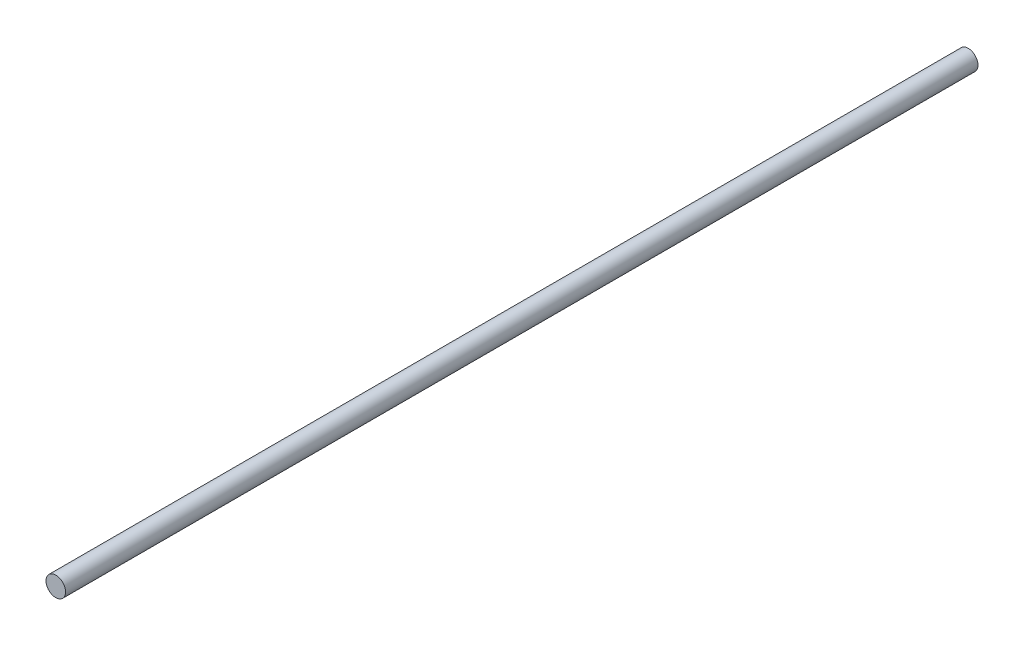
ISO-10303-21;
HEADER;
FILE_DESCRIPTION(('STEP AP214'),'2;1');
FILE_NAME('part.step','',(''),(''),'','','');
FILE_SCHEMA(('AUTOMOTIVE_DESIGN { 1 0 10303 214 1 1 1 1 }'));
ENDSEC;
DATA;
#1=APPLICATION_CONTEXT('core data for automotive mechanical design processes');
#2=APPLICATION_PROTOCOL_DEFINITION('international standard','automotive_design',2000,#1);
#3=PRODUCT_CONTEXT('',#1,'mechanical');
#4=PRODUCT('Part','Part','',(#3));
#5=PRODUCT_RELATED_PRODUCT_CATEGORY('part','',(#4));
#6=PRODUCT_DEFINITION_FORMATION('','',#4);
#7=PRODUCT_DEFINITION_CONTEXT('part definition',#1,'design');
#8=PRODUCT_DEFINITION('design','',#6,#7);
#9=PRODUCT_DEFINITION_SHAPE('','',#8);
#10=(LENGTH_UNIT() NAMED_UNIT(*) SI_UNIT(.MILLI.,.METRE.));
#11=(NAMED_UNIT(*) PLANE_ANGLE_UNIT() SI_UNIT($,.RADIAN.));
#12=(NAMED_UNIT(*) SI_UNIT($,.STERADIAN.) SOLID_ANGLE_UNIT());
#13=UNCERTAINTY_MEASURE_WITH_UNIT(LENGTH_MEASURE(1.E-05),#10,'distance_accuracy_value','');
#14=(GEOMETRIC_REPRESENTATION_CONTEXT(3) GLOBAL_UNCERTAINTY_ASSIGNED_CONTEXT((#13)) GLOBAL_UNIT_ASSIGNED_CONTEXT((#10,
#11,#12)) REPRESENTATION_CONTEXT('',''));
#15=CARTESIAN_POINT('',(0.,0.,0.));
#16=DIRECTION('',(0.,0.,1.));
#17=DIRECTION('',(1.,0.,0.));
#18=AXIS2_PLACEMENT_3D('',#15,#16,#17);
#19=CARTESIAN_POINT('',(486.017766952973,721.017766952967,208.011786053531));
#20=DIRECTION('',(0.,0.,-1.));
#21=DIRECTION('',(-1.,0.,0.));
#22=AXIS2_PLACEMENT_3D('',#19,#20,#21);
#23=CYLINDRICAL_SURFACE('',#22,1.50000000000002);
#24=CARTESIAN_POINT('',(486.017766952973,721.017766952967,63.7691453664121));
#25=DIRECTION('',(0.,0.,1.));
#26=DIRECTION('',(1.,0.,0.));
#27=AXIS2_PLACEMENT_3D('',#24,#25,#26);
#28=CIRCLE('',#27,1.50000000000002);
#29=CARTESIAN_POINT('',(487.517766952973,721.017766952967,63.7691453664121));
#30=VERTEX_POINT('',#29);
#31=EDGE_CURVE('E39',#30,#30,#28,.T.);
#32=ORIENTED_EDGE('',*,*,#31,.T.);
#33=EDGE_LOOP('',(#32));
#34=FACE_BOUND('',#33,.T.);
#35=CARTESIAN_POINT('',(486.017766952973,721.017766952967,203.769145366412));
#36=DIRECTION('',(0.,0.,1.));
#37=DIRECTION('',(1.,0.,0.));
#38=AXIS2_PLACEMENT_3D('',#35,#36,#37);
#39=CIRCLE('',#38,1.50000000000002);
#40=CARTESIAN_POINT('',(487.517766952973,721.017766952967,203.769145366412));
#41=VERTEX_POINT('',#40);
#42=EDGE_CURVE('E10',#41,#41,#39,.T.);
#43=ORIENTED_EDGE('',*,*,#42,.F.);
#44=EDGE_LOOP('',(#43));
#45=FACE_BOUND('',#44,.T.);
#46=ADVANCED_FACE('F32',(#34,#45),#23,.T.);
#47=CARTESIAN_POINT('',(486.017766952973,721.017766952967,63.7691453664121));
#48=DIRECTION('',(0.,0.,1.));
#49=DIRECTION('',(1.,0.,0.));
#50=AXIS2_PLACEMENT_3D('',#47,#48,#49);
#51=PLANE('',#50);
#52=ORIENTED_EDGE('',*,*,#31,.F.);
#53=EDGE_LOOP('',(#52));
#54=FACE_BOUND('',#53,.T.);
#55=ADVANCED_FACE('F47',(#54),#51,.F.);
#56=CARTESIAN_POINT('',(355.,720.,203.769145366412));
#57=DIRECTION('',(0.,0.,1.));
#58=DIRECTION('',(1.,0.,0.));
#59=AXIS2_PLACEMENT_3D('',#56,#57,#58);
#60=PLANE('',#59);
#61=ORIENTED_EDGE('',*,*,#42,.T.);
#62=EDGE_LOOP('',(#61));
#63=FACE_BOUND('',#62,.T.);
#64=ADVANCED_FACE('F34',(#63),#60,.T.);
#65=CLOSED_SHELL('',(#46,#55,#64));
#66=MANIFOLD_SOLID_BREP('B2',#65);
#67=ADVANCED_BREP_SHAPE_REPRESENTATION('',(#18,#66),#14);
#68=SHAPE_DEFINITION_REPRESENTATION(#9,#67);
ENDSEC;
END-ISO-10303-21;
